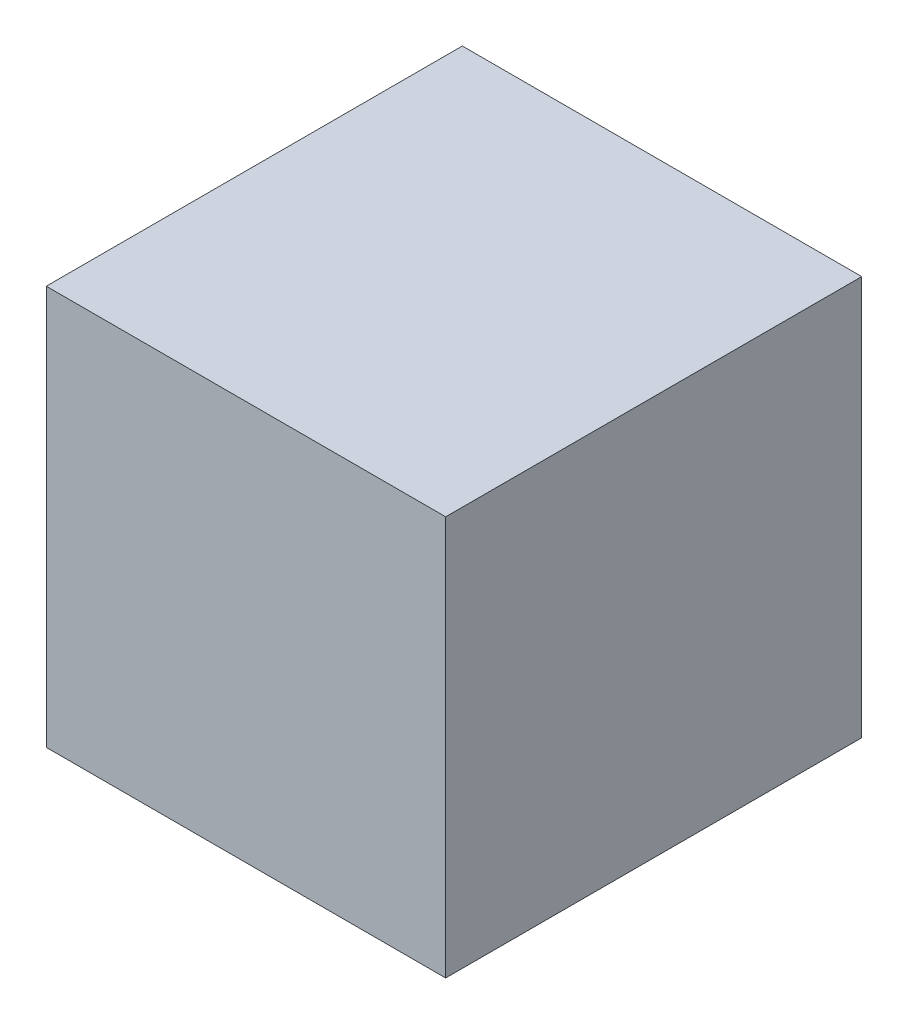
ISO-10303-21;
HEADER;
FILE_DESCRIPTION(('STEP AP214'),'2;1');
FILE_NAME('part.step','',(''),(''),'','','');
FILE_SCHEMA(('AUTOMOTIVE_DESIGN { 1 0 10303 214 1 1 1 1 }'));
ENDSEC;
DATA;
#1=APPLICATION_CONTEXT('core data for automotive mechanical design processes');
#2=APPLICATION_PROTOCOL_DEFINITION('international standard','automotive_design',2000,#1);
#3=PRODUCT_CONTEXT('',#1,'mechanical');
#4=PRODUCT('Part','Part','',(#3));
#5=PRODUCT_RELATED_PRODUCT_CATEGORY('part','',(#4));
#6=PRODUCT_DEFINITION_FORMATION('','',#4);
#7=PRODUCT_DEFINITION_CONTEXT('part definition',#1,'design');
#8=PRODUCT_DEFINITION('design','',#6,#7);
#9=PRODUCT_DEFINITION_SHAPE('','',#8);
#10=(LENGTH_UNIT() NAMED_UNIT(*) SI_UNIT(.MILLI.,.METRE.));
#11=(NAMED_UNIT(*) PLANE_ANGLE_UNIT() SI_UNIT($,.RADIAN.));
#12=(NAMED_UNIT(*) SI_UNIT($,.STERADIAN.) SOLID_ANGLE_UNIT());
#13=UNCERTAINTY_MEASURE_WITH_UNIT(LENGTH_MEASURE(1.E-05),#10,'distance_accuracy_value','');
#14=(GEOMETRIC_REPRESENTATION_CONTEXT(3) GLOBAL_UNCERTAINTY_ASSIGNED_CONTEXT((#13)) GLOBAL_UNIT_ASSIGNED_CONTEXT((#10,
#11,#12)) REPRESENTATION_CONTEXT('',''));
#15=CARTESIAN_POINT('',(0.,0.,0.));
#16=DIRECTION('',(0.,0.,1.));
#17=DIRECTION('',(1.,0.,0.));
#18=AXIS2_PLACEMENT_3D('',#15,#16,#17);
#19=CARTESIAN_POINT('',(24.,24.,50.));
#20=DIRECTION('',(-1.,0.,0.));
#21=DIRECTION('',(0.,-1.,0.));
#22=AXIS2_PLACEMENT_3D('',#19,#20,#21);
#23=PLANE('',#22);
#24=DIRECTION('',(0.,1.,0.));
#25=VECTOR('',#24,1.);
#26=CARTESIAN_POINT('',(24.,24.,0.));
#27=LINE('',#26,#25);
#28=CARTESIAN_POINT('',(24.,-24.,0.));
#29=VERTEX_POINT('',#28);
#30=CARTESIAN_POINT('',(24.,24.,0.));
#31=VERTEX_POINT('',#30);
#32=EDGE_CURVE('E97',#29,#31,#27,.T.);
#33=ORIENTED_EDGE('',*,*,#32,.T.);
#34=DIRECTION('',(0.,0.,-1.));
#35=VECTOR('',#34,1.);
#36=CARTESIAN_POINT('',(24.,24.,50.));
#37=LINE('',#36,#35);
#38=CARTESIAN_POINT('',(24.,24.,50.));
#39=VERTEX_POINT('',#38);
#40=EDGE_CURVE('E11',#39,#31,#37,.T.);
#41=ORIENTED_EDGE('',*,*,#40,.F.);
#42=DIRECTION('',(0.,1.,0.));
#43=VECTOR('',#42,1.);
#44=CARTESIAN_POINT('',(24.,24.,50.));
#45=LINE('',#44,#43);
#46=CARTESIAN_POINT('',(24.,-24.,50.));
#47=VERTEX_POINT('',#46);
#48=EDGE_CURVE('E85',#47,#39,#45,.T.);
#49=ORIENTED_EDGE('',*,*,#48,.F.);
#50=DIRECTION('',(0.,0.,-1.));
#51=VECTOR('',#50,1.);
#52=CARTESIAN_POINT('',(24.,-24.,50.));
#53=LINE('',#52,#51);
#54=EDGE_CURVE('E93',#47,#29,#53,.T.);
#55=ORIENTED_EDGE('',*,*,#54,.T.);
#56=EDGE_LOOP('',(#33,#41,#49,#55));
#57=FACE_BOUND('',#56,.T.);
#58=ADVANCED_FACE('F34',(#57),#23,.F.);
#59=CARTESIAN_POINT('',(-24.,24.,50.));
#60=DIRECTION('',(0.,-1.,0.));
#61=DIRECTION('',(0.,0.,-1.));
#62=AXIS2_PLACEMENT_3D('',#59,#60,#61);
#63=PLANE('',#62);
#64=DIRECTION('',(-1.,0.,0.));
#65=VECTOR('',#64,1.);
#66=CARTESIAN_POINT('',(-24.,24.,0.));
#67=LINE('',#66,#65);
#68=CARTESIAN_POINT('',(-24.,24.,0.));
#69=VERTEX_POINT('',#68);
#70=EDGE_CURVE('E89',#31,#69,#67,.T.);
#71=ORIENTED_EDGE('',*,*,#70,.T.);
#72=DIRECTION('',(0.,0.,-1.));
#73=VECTOR('',#72,1.);
#74=CARTESIAN_POINT('',(-24.,24.,50.));
#75=LINE('',#74,#73);
#76=CARTESIAN_POINT('',(-24.,24.,50.));
#77=VERTEX_POINT('',#76);
#78=EDGE_CURVE('E42',#77,#69,#75,.T.);
#79=ORIENTED_EDGE('',*,*,#78,.F.);
#80=DIRECTION('',(-1.,0.,0.));
#81=VECTOR('',#80,1.);
#82=CARTESIAN_POINT('',(-24.,24.,50.));
#83=LINE('',#82,#81);
#84=EDGE_CURVE('E80',#39,#77,#83,.T.);
#85=ORIENTED_EDGE('',*,*,#84,.F.);
#86=ORIENTED_EDGE('',*,*,#40,.T.);
#87=EDGE_LOOP('',(#71,#79,#85,#86));
#88=FACE_BOUND('',#87,.T.);
#89=ADVANCED_FACE('F88',(#88),#63,.F.);
#90=CARTESIAN_POINT('',(-24.,24.,50.));
#91=DIRECTION('',(1.,0.,0.));
#92=DIRECTION('',(0.,1.,0.));
#93=AXIS2_PLACEMENT_3D('',#90,#91,#92);
#94=PLANE('',#93);
#95=CARTESIAN_POINT('',(-24.,0.,26.));
#96=DIRECTION('',(-1.,0.,0.));
#97=DIRECTION('',(0.,-1.,0.));
#98=AXIS2_PLACEMENT_3D('',#95,#96,#97);
#99=CIRCLE('',#98,5.);
#100=CARTESIAN_POINT('',(-24.,-5.,26.));
#101=VERTEX_POINT('',#100);
#102=EDGE_CURVE('E111',#101,#101,#99,.T.);
#103=ORIENTED_EDGE('',*,*,#102,.F.);
#104=EDGE_LOOP('',(#103));
#105=FACE_BOUND('',#104,.T.);
#106=DIRECTION('',(0.,-1.,0.));
#107=VECTOR('',#106,1.);
#108=CARTESIAN_POINT('',(-24.,24.,0.));
#109=LINE('',#108,#107);
#110=CARTESIAN_POINT('',(-24.,-24.,0.));
#111=VERTEX_POINT('',#110);
#112=EDGE_CURVE('E67',#69,#111,#109,.T.);
#113=ORIENTED_EDGE('',*,*,#112,.T.);
#114=DIRECTION('',(0.,0.,-1.));
#115=VECTOR('',#114,1.);
#116=CARTESIAN_POINT('',(-24.,-24.,50.));
#117=LINE('',#116,#115);
#118=CARTESIAN_POINT('',(-24.,-24.,50.));
#119=VERTEX_POINT('',#118);
#120=EDGE_CURVE('E90',#119,#111,#117,.T.);
#121=ORIENTED_EDGE('',*,*,#120,.F.);
#122=DIRECTION('',(0.,-1.,0.));
#123=VECTOR('',#122,1.);
#124=CARTESIAN_POINT('',(-24.,24.,50.));
#125=LINE('',#124,#123);
#126=EDGE_CURVE('E83',#77,#119,#125,.T.);
#127=ORIENTED_EDGE('',*,*,#126,.F.);
#128=ORIENTED_EDGE('',*,*,#78,.T.);
#129=EDGE_LOOP('',(#113,#121,#127,#128));
#130=FACE_BOUND('',#129,.T.);
#131=ADVANCED_FACE('F91',(#105,#130),#94,.F.);
#132=CARTESIAN_POINT('',(-24.,-24.,50.));
#133=DIRECTION('',(0.,1.,0.));
#134=DIRECTION('',(0.,0.,1.));
#135=AXIS2_PLACEMENT_3D('',#132,#133,#134);
#136=PLANE('',#135);
#137=DIRECTION('',(1.,0.,0.));
#138=VECTOR('',#137,1.);
#139=CARTESIAN_POINT('',(-24.,-24.,0.));
#140=LINE('',#139,#138);
#141=EDGE_CURVE('E73',#111,#29,#140,.T.);
#142=ORIENTED_EDGE('',*,*,#141,.T.);
#143=ORIENTED_EDGE('',*,*,#54,.F.);
#144=DIRECTION('',(1.,0.,0.));
#145=VECTOR('',#144,1.);
#146=CARTESIAN_POINT('',(-24.,-24.,50.));
#147=LINE('',#146,#145);
#148=EDGE_CURVE('E50',#119,#47,#147,.T.);
#149=ORIENTED_EDGE('',*,*,#148,.F.);
#150=ORIENTED_EDGE('',*,*,#120,.T.);
#151=EDGE_LOOP('',(#142,#143,#149,#150));
#152=FACE_BOUND('',#151,.T.);
#153=ADVANCED_FACE('F105',(#152),#136,.F.);
#154=CARTESIAN_POINT('',(0.,0.,50.));
#155=DIRECTION('',(0.,0.,1.));
#156=DIRECTION('',(1.,0.,0.));
#157=AXIS2_PLACEMENT_3D('',#154,#155,#156);
#158=PLANE('',#157);
#159=ORIENTED_EDGE('',*,*,#48,.T.);
#160=ORIENTED_EDGE('',*,*,#84,.T.);
#161=ORIENTED_EDGE('',*,*,#126,.T.);
#162=ORIENTED_EDGE('',*,*,#148,.T.);
#163=EDGE_LOOP('',(#159,#160,#161,#162));
#164=FACE_BOUND('',#163,.T.);
#165=ADVANCED_FACE('F81',(#164),#158,.T.);
#166=CARTESIAN_POINT('',(0.,0.,0.));
#167=DIRECTION('',(0.,0.,1.));
#168=DIRECTION('',(1.,0.,0.));
#169=AXIS2_PLACEMENT_3D('',#166,#167,#168);
#170=PLANE('',#169);
#171=ORIENTED_EDGE('',*,*,#32,.F.);
#172=ORIENTED_EDGE('',*,*,#141,.F.);
#173=ORIENTED_EDGE('',*,*,#112,.F.);
#174=ORIENTED_EDGE('',*,*,#70,.F.);
#175=EDGE_LOOP('',(#171,#172,#173,#174));
#176=FACE_BOUND('',#175,.T.);
#177=ADVANCED_FACE('F108',(#176),#170,.F.);
#178=CARTESIAN_POINT('',(-14.,0.,26.));
#179=DIRECTION('',(-1.,0.,0.));
#180=DIRECTION('',(0.,-1.,0.));
#181=AXIS2_PLACEMENT_3D('',#178,#179,#180);
#182=CYLINDRICAL_SURFACE('',#181,5.);
#183=CARTESIAN_POINT('',(-14.,0.,26.));
#184=DIRECTION('',(-1.,0.,0.));
#185=DIRECTION('',(0.,-1.,0.));
#186=AXIS2_PLACEMENT_3D('',#183,#184,#185);
#187=CIRCLE('',#186,5.);
#188=CARTESIAN_POINT('',(-14.,-5.,26.));
#189=VERTEX_POINT('',#188);
#190=EDGE_CURVE('E100',#189,#189,#187,.T.);
#191=ORIENTED_EDGE('',*,*,#190,.F.);
#192=EDGE_LOOP('',(#191));
#193=FACE_BOUND('',#192,.T.);
#194=ORIENTED_EDGE('',*,*,#102,.T.);
#195=EDGE_LOOP('',(#194));
#196=FACE_BOUND('',#195,.T.);
#197=ADVANCED_FACE('F119',(#193,#196),#182,.F.);
#198=CARTESIAN_POINT('',(-14.,0.,26.));
#199=DIRECTION('',(-1.,0.,0.));
#200=DIRECTION('',(0.,-1.,0.));
#201=AXIS2_PLACEMENT_3D('',#198,#199,#200);
#202=PLANE('',#201);
#203=ORIENTED_EDGE('',*,*,#190,.T.);
#204=EDGE_LOOP('',(#203));
#205=FACE_BOUND('',#204,.T.);
#206=ADVANCED_FACE('F117',(#205),#202,.T.);
#207=CLOSED_SHELL('',(#58,#89,#131,#153,#165,#177,#197,#206));
#208=MANIFOLD_SOLID_BREP('B2',#207);
#209=ADVANCED_BREP_SHAPE_REPRESENTATION('',(#18,#208),#14);
#210=SHAPE_DEFINITION_REPRESENTATION(#9,#209);
ENDSEC;
END-ISO-10303-21;
